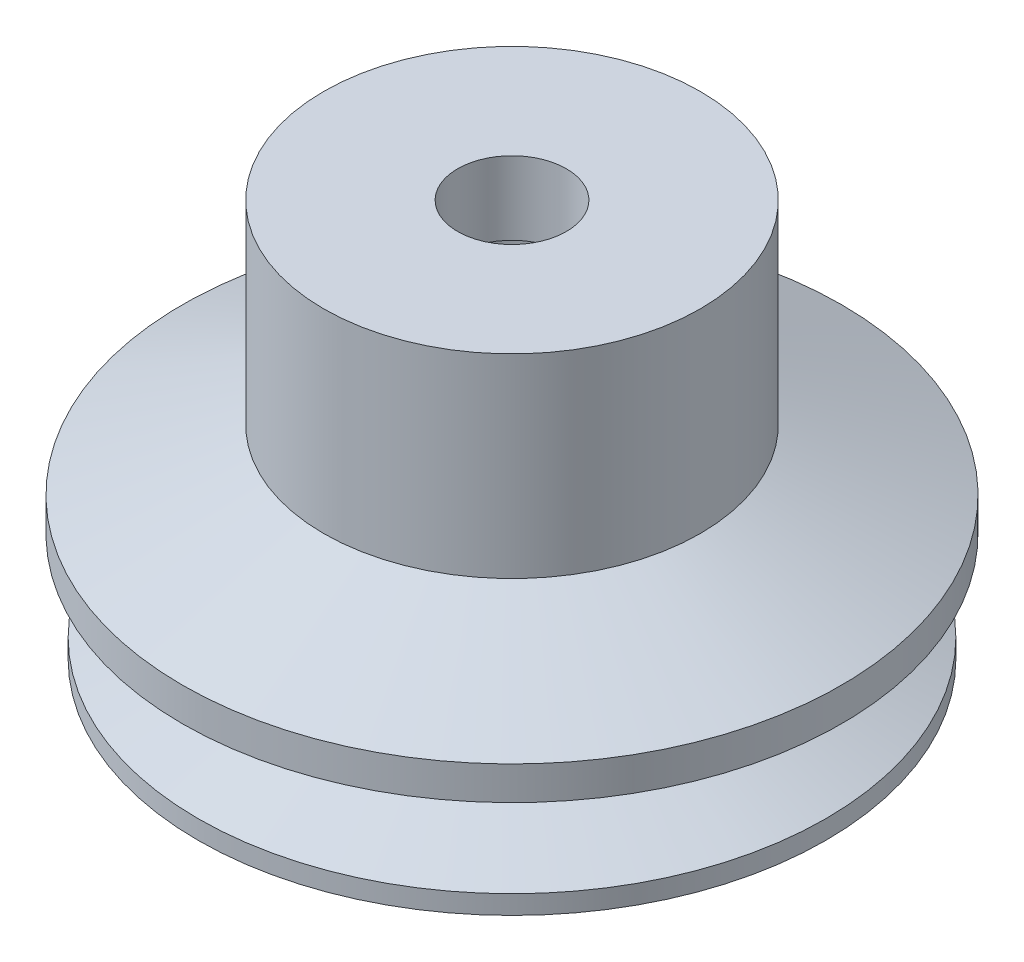
ISO-10303-21;
HEADER;
FILE_DESCRIPTION(('STEP AP214'),'2;1');
FILE_NAME('part.step','',(''),(''),'','','');
FILE_SCHEMA(('AUTOMOTIVE_DESIGN { 1 0 10303 214 1 1 1 1 }'));
ENDSEC;
DATA;
#1=APPLICATION_CONTEXT('core data for automotive mechanical design processes');
#2=APPLICATION_PROTOCOL_DEFINITION('international standard','automotive_design',2000,#1);
#3=PRODUCT_CONTEXT('',#1,'mechanical');
#4=PRODUCT('Part','Part','',(#3));
#5=PRODUCT_RELATED_PRODUCT_CATEGORY('part','',(#4));
#6=PRODUCT_DEFINITION_FORMATION('','',#4);
#7=PRODUCT_DEFINITION_CONTEXT('part definition',#1,'design');
#8=PRODUCT_DEFINITION('design','',#6,#7);
#9=PRODUCT_DEFINITION_SHAPE('','',#8);
#10=(LENGTH_UNIT() NAMED_UNIT(*) SI_UNIT(.MILLI.,.METRE.));
#11=(NAMED_UNIT(*) PLANE_ANGLE_UNIT() SI_UNIT($,.RADIAN.));
#12=(NAMED_UNIT(*) SI_UNIT($,.STERADIAN.) SOLID_ANGLE_UNIT());
#13=UNCERTAINTY_MEASURE_WITH_UNIT(LENGTH_MEASURE(1.E-05),#10,'distance_accuracy_value','');
#14=(GEOMETRIC_REPRESENTATION_CONTEXT(3) GLOBAL_UNCERTAINTY_ASSIGNED_CONTEXT((#13)) GLOBAL_UNIT_ASSIGNED_CONTEXT((#10,
#11,#12)) REPRESENTATION_CONTEXT('',''));
#15=CARTESIAN_POINT('',(0.,0.,0.));
#16=DIRECTION('',(0.,0.,1.));
#17=DIRECTION('',(1.,0.,0.));
#18=AXIS2_PLACEMENT_3D('',#15,#16,#17);
#19=CARTESIAN_POINT('',(0.,3.2,0.));
#20=DIRECTION('',(0.,-1.,0.));
#21=DIRECTION('',(0.,0.,-1.));
#22=AXIS2_PLACEMENT_3D('',#19,#20,#21);
#23=CONICAL_SURFACE('',#22,9.61114440584415,1.16739633265852);
#24=CARTESIAN_POINT('',(0.,0.899999999999999,0.));
#25=DIRECTION('',(0.,-1.,0.));
#26=DIRECTION('',(0.,0.,-1.));
#27=AXIS2_PLACEMENT_3D('',#24,#25,#26);
#28=CIRCLE('',#27,15.);
#29=CARTESIAN_POINT('',(0.,0.899999999999999,-15.));
#30=VERTEX_POINT('',#29);
#31=EDGE_CURVE('E10',#30,#30,#28,.T.);
#32=ORIENTED_EDGE('',*,*,#31,.F.);
#33=EDGE_LOOP('',(#32));
#34=FACE_BOUND('',#33,.T.);
#35=CARTESIAN_POINT('',(0.,3.2,0.));
#36=DIRECTION('',(0.,-1.,0.));
#37=DIRECTION('',(0.,0.,-1.));
#38=AXIS2_PLACEMENT_3D('',#35,#36,#37);
#39=CIRCLE('',#38,9.61114440584415);
#40=CARTESIAN_POINT('',(0.,3.2,-9.61114440584415));
#41=VERTEX_POINT('',#40);
#42=EDGE_CURVE('E82',#41,#41,#39,.T.);
#43=ORIENTED_EDGE('',*,*,#42,.T.);
#44=EDGE_LOOP('',(#43));
#45=FACE_BOUND('',#44,.T.);
#46=ADVANCED_FACE('F30',(#34,#45),#23,.T.);
#47=CARTESIAN_POINT('',(0.,0.,0.));
#48=DIRECTION('',(0.,-1.,0.));
#49=DIRECTION('',(0.,0.,-1.));
#50=AXIS2_PLACEMENT_3D('',#47,#48,#49);
#51=CYLINDRICAL_SURFACE('',#50,15.);
#52=CARTESIAN_POINT('',(0.,0.,0.));
#53=DIRECTION('',(0.,-1.,0.));
#54=DIRECTION('',(0.,0.,-1.));
#55=AXIS2_PLACEMENT_3D('',#52,#53,#54);
#56=CIRCLE('',#55,15.);
#57=CARTESIAN_POINT('',(0.,0.,-15.));
#58=VERTEX_POINT('',#57);
#59=EDGE_CURVE('E36',#58,#58,#56,.T.);
#60=ORIENTED_EDGE('',*,*,#59,.F.);
#61=EDGE_LOOP('',(#60));
#62=FACE_BOUND('',#61,.T.);
#63=ORIENTED_EDGE('',*,*,#31,.T.);
#64=EDGE_LOOP('',(#63));
#65=FACE_BOUND('',#64,.T.);
#66=ADVANCED_FACE('F167',(#62,#65),#51,.T.);
#67=CARTESIAN_POINT('',(0.,0.,0.));
#68=DIRECTION('',(0.,-1.,0.));
#69=DIRECTION('',(0.,0.,-1.));
#70=AXIS2_PLACEMENT_3D('',#67,#68,#69);
#71=CONICAL_SURFACE('',#70,15.,1.16751484507606);
#72=CARTESIAN_POINT('',(0.,3.2,0.));
#73=DIRECTION('',(0.,-1.,0.));
#74=DIRECTION('',(0.,0.,-1.));
#75=AXIS2_PLACEMENT_3D('',#72,#73,#74);
#76=CIRCLE('',#75,7.5);
#77=CARTESIAN_POINT('',(0.,3.2,-7.5));
#78=VERTEX_POINT('',#77);
#79=EDGE_CURVE('E40',#78,#78,#76,.T.);
#80=ORIENTED_EDGE('',*,*,#79,.F.);
#81=EDGE_LOOP('',(#80));
#82=FACE_BOUND('',#81,.T.);
#83=ORIENTED_EDGE('',*,*,#59,.T.);
#84=EDGE_LOOP('',(#83));
#85=FACE_BOUND('',#84,.T.);
#86=ADVANCED_FACE('F162',(#82,#85),#71,.F.);
#87=CARTESIAN_POINT('',(0.,3.2,0.));
#88=DIRECTION('',(0.,1.,0.));
#89=DIRECTION('',(0.,0.,1.));
#90=AXIS2_PLACEMENT_3D('',#87,#88,#89);
#91=CONICAL_SURFACE('',#90,7.5,1.14960684652837);
#92=CARTESIAN_POINT('',(0.,6.,0.));
#93=DIRECTION('',(0.,-1.,0.));
#94=DIRECTION('',(0.,0.,-1.));
#95=AXIS2_PLACEMENT_3D('',#92,#93,#94);
#96=CIRCLE('',#95,13.75);
#97=CARTESIAN_POINT('',(0.,6.,-13.75));
#98=VERTEX_POINT('',#97);
#99=EDGE_CURVE('E44',#98,#98,#96,.T.);
#100=ORIENTED_EDGE('',*,*,#99,.F.);
#101=EDGE_LOOP('',(#100));
#102=FACE_BOUND('',#101,.T.);
#103=ORIENTED_EDGE('',*,*,#79,.T.);
#104=EDGE_LOOP('',(#103));
#105=FACE_BOUND('',#104,.T.);
#106=ADVANCED_FACE('F156',(#102,#105),#91,.F.);
#107=CARTESIAN_POINT('',(0.,6.,0.));
#108=DIRECTION('',(0.,-1.,0.));
#109=DIRECTION('',(0.,0.,-1.));
#110=AXIS2_PLACEMENT_3D('',#107,#108,#109);
#111=CONICAL_SURFACE('',#110,13.75,1.12327635163773);
#112=CARTESIAN_POINT('',(0.,9.,0.));
#113=DIRECTION('',(0.,-1.,0.));
#114=DIRECTION('',(0.,0.,-1.));
#115=AXIS2_PLACEMENT_3D('',#112,#113,#114);
#116=CIRCLE('',#115,7.5);
#117=CARTESIAN_POINT('',(0.,9.,-7.5));
#118=VERTEX_POINT('',#117);
#119=EDGE_CURVE('E49',#118,#118,#116,.T.);
#120=ORIENTED_EDGE('',*,*,#119,.F.);
#121=EDGE_LOOP('',(#120));
#122=FACE_BOUND('',#121,.T.);
#123=ORIENTED_EDGE('',*,*,#99,.T.);
#124=EDGE_LOOP('',(#123));
#125=FACE_BOUND('',#124,.T.);
#126=ADVANCED_FACE('F150',(#122,#125),#111,.F.);
#127=CARTESIAN_POINT('',(0.,9.,2.55));
#128=DIRECTION('',(0.,1.,0.));
#129=DIRECTION('',(0.,0.,1.));
#130=AXIS2_PLACEMENT_3D('',#127,#128,#129);
#131=PLANE('',#130);
#132=CARTESIAN_POINT('',(0.,9.,0.));
#133=DIRECTION('',(0.,-1.,0.));
#134=DIRECTION('',(0.,0.,-1.));
#135=AXIS2_PLACEMENT_3D('',#132,#133,#134);
#136=CIRCLE('',#135,2.55);
#137=CARTESIAN_POINT('',(0.,9.,-2.55));
#138=VERTEX_POINT('',#137);
#139=EDGE_CURVE('E52',#138,#138,#136,.T.);
#140=ORIENTED_EDGE('',*,*,#139,.F.);
#141=EDGE_LOOP('',(#140));
#142=FACE_BOUND('',#141,.T.);
#143=ORIENTED_EDGE('',*,*,#119,.T.);
#144=EDGE_LOOP('',(#143));
#145=FACE_BOUND('',#144,.T.);
#146=ADVANCED_FACE('F144',(#142,#145),#131,.F.);
#147=CARTESIAN_POINT('',(0.,0.,0.));
#148=DIRECTION('',(0.,-1.,0.));
#149=DIRECTION('',(0.,0.,-1.));
#150=AXIS2_PLACEMENT_3D('',#147,#148,#149);
#151=CYLINDRICAL_SURFACE('',#150,2.55);
#152=CARTESIAN_POINT('',(0.,13.5,0.));
#153=DIRECTION('',(0.,-1.,0.));
#154=DIRECTION('',(0.,0.,-1.));
#155=AXIS2_PLACEMENT_3D('',#152,#153,#154);
#156=CIRCLE('',#155,2.55);
#157=CARTESIAN_POINT('',(0.,13.5,-2.55));
#158=VERTEX_POINT('',#157);
#159=EDGE_CURVE('E55',#158,#158,#156,.T.);
#160=ORIENTED_EDGE('',*,*,#159,.F.);
#161=EDGE_LOOP('',(#160));
#162=FACE_BOUND('',#161,.T.);
#163=ORIENTED_EDGE('',*,*,#139,.T.);
#164=EDGE_LOOP('',(#163));
#165=FACE_BOUND('',#164,.T.);
#166=ADVANCED_FACE('F138',(#162,#165),#151,.F.);
#167=CARTESIAN_POINT('',(0.,13.5,3.6));
#168=DIRECTION('',(0.,-1.,0.));
#169=DIRECTION('',(0.,0.,-1.));
#170=AXIS2_PLACEMENT_3D('',#167,#168,#169);
#171=PLANE('',#170);
#172=CARTESIAN_POINT('',(0.,13.5,0.));
#173=DIRECTION('',(0.,-1.,0.));
#174=DIRECTION('',(0.,0.,-1.));
#175=AXIS2_PLACEMENT_3D('',#172,#173,#174);
#176=CIRCLE('',#175,3.6);
#177=CARTESIAN_POINT('',(0.,13.5,-3.6));
#178=VERTEX_POINT('',#177);
#179=EDGE_CURVE('E58',#178,#178,#176,.T.);
#180=ORIENTED_EDGE('',*,*,#179,.F.);
#181=EDGE_LOOP('',(#180));
#182=FACE_BOUND('',#181,.T.);
#183=ORIENTED_EDGE('',*,*,#159,.T.);
#184=EDGE_LOOP('',(#183));
#185=FACE_BOUND('',#184,.T.);
#186=ADVANCED_FACE('F132',(#182,#185),#171,.F.);
#187=CARTESIAN_POINT('',(0.,0.,0.));
#188=DIRECTION('',(0.,-1.,0.));
#189=DIRECTION('',(0.,0.,-1.));
#190=AXIS2_PLACEMENT_3D('',#187,#188,#189);
#191=CYLINDRICAL_SURFACE('',#190,3.6);
#192=CARTESIAN_POINT('',(0.,15.5,0.));
#193=DIRECTION('',(0.,-1.,0.));
#194=DIRECTION('',(0.,0.,-1.));
#195=AXIS2_PLACEMENT_3D('',#192,#193,#194);
#196=CIRCLE('',#195,3.6);
#197=CARTESIAN_POINT('',(0.,15.5,-3.6));
#198=VERTEX_POINT('',#197);
#199=EDGE_CURVE('E61',#198,#198,#196,.T.);
#200=ORIENTED_EDGE('',*,*,#199,.F.);
#201=EDGE_LOOP('',(#200));
#202=FACE_BOUND('',#201,.T.);
#203=ORIENTED_EDGE('',*,*,#179,.T.);
#204=EDGE_LOOP('',(#203));
#205=FACE_BOUND('',#204,.T.);
#206=ADVANCED_FACE('F126',(#202,#205),#191,.F.);
#207=CARTESIAN_POINT('',(0.,15.5,2.6));
#208=DIRECTION('',(0.,1.,0.));
#209=DIRECTION('',(0.,0.,1.));
#210=AXIS2_PLACEMENT_3D('',#207,#208,#209);
#211=PLANE('',#210);
#212=CARTESIAN_POINT('',(0.,15.5,0.));
#213=DIRECTION('',(0.,-1.,0.));
#214=DIRECTION('',(0.,0.,-1.));
#215=AXIS2_PLACEMENT_3D('',#212,#213,#214);
#216=CIRCLE('',#215,2.6);
#217=CARTESIAN_POINT('',(0.,15.5,-2.6));
#218=VERTEX_POINT('',#217);
#219=EDGE_CURVE('E64',#218,#218,#216,.T.);
#220=ORIENTED_EDGE('',*,*,#219,.F.);
#221=EDGE_LOOP('',(#220));
#222=FACE_BOUND('',#221,.T.);
#223=ORIENTED_EDGE('',*,*,#199,.T.);
#224=EDGE_LOOP('',(#223));
#225=FACE_BOUND('',#224,.T.);
#226=ADVANCED_FACE('F120',(#222,#225),#211,.F.);
#227=CARTESIAN_POINT('',(0.,0.,0.));
#228=DIRECTION('',(0.,-1.,0.));
#229=DIRECTION('',(0.,0.,-1.));
#230=AXIS2_PLACEMENT_3D('',#227,#228,#229);
#231=CYLINDRICAL_SURFACE('',#230,2.6);
#232=CARTESIAN_POINT('',(0.,19.,0.));
#233=DIRECTION('',(0.,-1.,0.));
#234=DIRECTION('',(0.,0.,-1.));
#235=AXIS2_PLACEMENT_3D('',#232,#233,#234);
#236=CIRCLE('',#235,2.6);
#237=CARTESIAN_POINT('',(0.,19.,-2.6));
#238=VERTEX_POINT('',#237);
#239=EDGE_CURVE('E67',#238,#238,#236,.T.);
#240=ORIENTED_EDGE('',*,*,#239,.F.);
#241=EDGE_LOOP('',(#240));
#242=FACE_BOUND('',#241,.T.);
#243=ORIENTED_EDGE('',*,*,#219,.T.);
#244=EDGE_LOOP('',(#243));
#245=FACE_BOUND('',#244,.T.);
#246=ADVANCED_FACE('F114',(#242,#245),#231,.F.);
#247=CARTESIAN_POINT('',(0.,19.,9.));
#248=DIRECTION('',(0.,-1.,0.));
#249=DIRECTION('',(0.,0.,-1.));
#250=AXIS2_PLACEMENT_3D('',#247,#248,#249);
#251=PLANE('',#250);
#252=CARTESIAN_POINT('',(0.,19.,0.));
#253=DIRECTION('',(0.,-1.,0.));
#254=DIRECTION('',(0.,0.,-1.));
#255=AXIS2_PLACEMENT_3D('',#252,#253,#254);
#256=CIRCLE('',#255,9.);
#257=CARTESIAN_POINT('',(0.,19.,-9.));
#258=VERTEX_POINT('',#257);
#259=EDGE_CURVE('E70',#258,#258,#256,.T.);
#260=ORIENTED_EDGE('',*,*,#259,.F.);
#261=EDGE_LOOP('',(#260));
#262=FACE_BOUND('',#261,.T.);
#263=ORIENTED_EDGE('',*,*,#239,.T.);
#264=EDGE_LOOP('',(#263));
#265=FACE_BOUND('',#264,.T.);
#266=ADVANCED_FACE('F108',(#262,#265),#251,.F.);
#267=CARTESIAN_POINT('',(0.,0.,0.));
#268=DIRECTION('',(0.,-1.,0.));
#269=DIRECTION('',(0.,0.,-1.));
#270=AXIS2_PLACEMENT_3D('',#267,#268,#269);
#271=CYLINDRICAL_SURFACE('',#270,9.);
#272=CARTESIAN_POINT('',(0.,9.7,0.));
#273=DIRECTION('',(0.,-1.,0.));
#274=DIRECTION('',(0.,0.,-1.));
#275=AXIS2_PLACEMENT_3D('',#272,#273,#274);
#276=CIRCLE('',#275,9.);
#277=CARTESIAN_POINT('',(0.,9.7,-9.));
#278=VERTEX_POINT('',#277);
#279=EDGE_CURVE('E73',#278,#278,#276,.T.);
#280=ORIENTED_EDGE('',*,*,#279,.F.);
#281=EDGE_LOOP('',(#280));
#282=FACE_BOUND('',#281,.T.);
#283=ORIENTED_EDGE('',*,*,#259,.T.);
#284=EDGE_LOOP('',(#283));
#285=FACE_BOUND('',#284,.T.);
#286=ADVANCED_FACE('F102',(#282,#285),#271,.T.);
#287=CARTESIAN_POINT('',(0.,9.7,0.));
#288=DIRECTION('',(0.,-1.,0.));
#289=DIRECTION('',(0.,0.,-1.));
#290=AXIS2_PLACEMENT_3D('',#287,#288,#289);
#291=CONICAL_SURFACE('',#290,9.,1.16501088569856);
#292=CARTESIAN_POINT('',(0.,6.8,0.));
#293=DIRECTION('',(0.,-1.,0.));
#294=DIRECTION('',(0.,0.,-1.));
#295=AXIS2_PLACEMENT_3D('',#292,#293,#294);
#296=CIRCLE('',#295,15.75);
#297=CARTESIAN_POINT('',(0.,6.8,-15.75));
#298=VERTEX_POINT('',#297);
#299=EDGE_CURVE('E76',#298,#298,#296,.T.);
#300=ORIENTED_EDGE('',*,*,#299,.F.);
#301=EDGE_LOOP('',(#300));
#302=FACE_BOUND('',#301,.T.);
#303=ORIENTED_EDGE('',*,*,#279,.T.);
#304=EDGE_LOOP('',(#303));
#305=FACE_BOUND('',#304,.T.);
#306=ADVANCED_FACE('F96',(#302,#305),#291,.T.);
#307=CARTESIAN_POINT('',(0.,0.,0.));
#308=DIRECTION('',(0.,-1.,0.));
#309=DIRECTION('',(0.,0.,-1.));
#310=AXIS2_PLACEMENT_3D('',#307,#308,#309);
#311=CYLINDRICAL_SURFACE('',#310,15.75);
#312=CARTESIAN_POINT('',(0.,5.2,0.));
#313=DIRECTION('',(0.,-1.,0.));
#314=DIRECTION('',(0.,0.,-1.));
#315=AXIS2_PLACEMENT_3D('',#312,#313,#314);
#316=CIRCLE('',#315,15.75);
#317=CARTESIAN_POINT('',(0.,5.2,-15.75));
#318=VERTEX_POINT('',#317);
#319=EDGE_CURVE('E79',#318,#318,#316,.T.);
#320=ORIENTED_EDGE('',*,*,#319,.F.);
#321=EDGE_LOOP('',(#320));
#322=FACE_BOUND('',#321,.T.);
#323=ORIENTED_EDGE('',*,*,#299,.T.);
#324=EDGE_LOOP('',(#323));
#325=FACE_BOUND('',#324,.T.);
#326=ADVANCED_FACE('F90',(#322,#325),#311,.T.);
#327=CARTESIAN_POINT('',(0.,5.2,0.));
#328=DIRECTION('',(0.,1.,0.));
#329=DIRECTION('',(0.,0.,1.));
#330=AXIS2_PLACEMENT_3D('',#327,#328,#329);
#331=CONICAL_SURFACE('',#330,15.75,1.25584679113759);
#332=ORIENTED_EDGE('',*,*,#42,.F.);
#333=EDGE_LOOP('',(#332));
#334=FACE_BOUND('',#333,.T.);
#335=ORIENTED_EDGE('',*,*,#319,.T.);
#336=EDGE_LOOP('',(#335));
#337=FACE_BOUND('',#336,.T.);
#338=ADVANCED_FACE('F87',(#334,#337),#331,.T.);
#339=CLOSED_SHELL('',(#46,#66,#86,#106,#126,#146,#166,#186,#206,#226,#246,#266,#286,#306,#326,#338));
#340=MANIFOLD_SOLID_BREP('B2',#339);
#341=ADVANCED_BREP_SHAPE_REPRESENTATION('',(#18,#340),#14);
#342=SHAPE_DEFINITION_REPRESENTATION(#9,#341);
ENDSEC;
END-ISO-10303-21;
